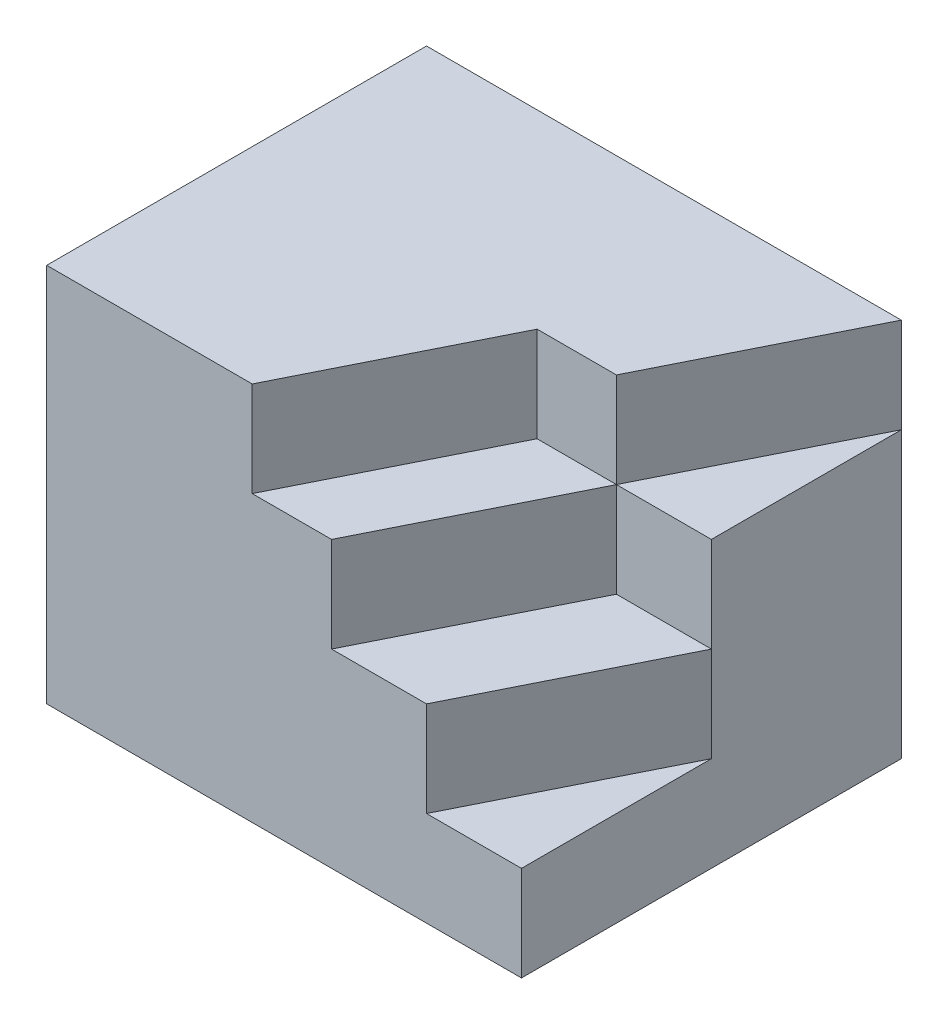
ISO-10303-21;
HEADER;
FILE_DESCRIPTION(('STEP AP214'),'2;1');
FILE_NAME('part.step','',(''),(''),'','','');
FILE_SCHEMA(('AUTOMOTIVE_DESIGN { 1 0 10303 214 1 1 1 1 }'));
ENDSEC;
DATA;
#1=APPLICATION_CONTEXT('core data for automotive mechanical design processes');
#2=APPLICATION_PROTOCOL_DEFINITION('international standard','automotive_design',2000,#1);
#3=PRODUCT_CONTEXT('',#1,'mechanical');
#4=PRODUCT('Part','Part','',(#3));
#5=PRODUCT_RELATED_PRODUCT_CATEGORY('part','',(#4));
#6=PRODUCT_DEFINITION_FORMATION('','',#4);
#7=PRODUCT_DEFINITION_CONTEXT('part definition',#1,'design');
#8=PRODUCT_DEFINITION('design','',#6,#7);
#9=PRODUCT_DEFINITION_SHAPE('','',#8);
#10=(LENGTH_UNIT() NAMED_UNIT(*) SI_UNIT(.MILLI.,.METRE.));
#11=(NAMED_UNIT(*) PLANE_ANGLE_UNIT() SI_UNIT($,.RADIAN.));
#12=(NAMED_UNIT(*) SI_UNIT($,.STERADIAN.) SOLID_ANGLE_UNIT());
#13=UNCERTAINTY_MEASURE_WITH_UNIT(LENGTH_MEASURE(1.E-05),#10,'distance_accuracy_value','');
#14=(GEOMETRIC_REPRESENTATION_CONTEXT(3) GLOBAL_UNCERTAINTY_ASSIGNED_CONTEXT((#13)) GLOBAL_UNIT_ASSIGNED_CONTEXT((#10,
#11,#12)) REPRESENTATION_CONTEXT('',''));
#15=CARTESIAN_POINT('',(0.,0.,0.));
#16=DIRECTION('',(0.,0.,1.));
#17=DIRECTION('',(1.,0.,0.));
#18=AXIS2_PLACEMENT_3D('',#15,#16,#17);
#19=CARTESIAN_POINT('',(15.,20.,0.));
#20=DIRECTION('',(-0.894427190999916,0.,-0.447213595499958));
#21=DIRECTION('',(-0.447213595499958,0.,0.894427190999916));
#22=AXIS2_PLACEMENT_3D('',#19,#20,#21);
#23=PLANE('',#22);
#24=DIRECTION('',(-0.447213595499958,0.,0.894427190999916));
#25=VECTOR('',#24,1.);
#26=CARTESIAN_POINT('',(15.,40.,0.));
#27=LINE('',#26,#25);
#28=CARTESIAN_POINT('',(25.,40.,-20.));
#29=VERTEX_POINT('',#28);
#30=CARTESIAN_POINT('',(15.,40.,0.));
#31=VERTEX_POINT('',#30);
#32=EDGE_CURVE('E154',#29,#31,#27,.T.);
#33=ORIENTED_EDGE('',*,*,#32,.T.);
#34=DIRECTION('',(0.,1.,0.));
#35=VECTOR('',#34,1.);
#36=CARTESIAN_POINT('',(15.,30.,0.));
#37=LINE('',#36,#35);
#38=CARTESIAN_POINT('',(15.,30.,0.));
#39=VERTEX_POINT('',#38);
#40=EDGE_CURVE('E133',#39,#31,#37,.T.);
#41=ORIENTED_EDGE('',*,*,#40,.F.);
#42=DIRECTION('',(-0.447213595499958,0.,0.894427190999916));
#43=VECTOR('',#42,1.);
#44=CARTESIAN_POINT('',(25.,30.,-20.));
#45=LINE('',#44,#43);
#46=CARTESIAN_POINT('',(25.,30.,-20.));
#47=VERTEX_POINT('',#46);
#48=EDGE_CURVE('E152',#47,#39,#45,.T.);
#49=ORIENTED_EDGE('',*,*,#48,.F.);
#50=DIRECTION('',(0.,-1.,0.));
#51=VECTOR('',#50,1.);
#52=CARTESIAN_POINT('',(25.,40.,-20.));
#53=LINE('',#52,#51);
#54=EDGE_CURVE('E11',#29,#47,#53,.T.);
#55=ORIENTED_EDGE('',*,*,#54,.F.);
#56=EDGE_LOOP('',(#33,#41,#49,#55));
#57=FACE_BOUND('',#56,.T.);
#58=ADVANCED_FACE('F39',(#57),#23,.F.);
#59=CARTESIAN_POINT('',(25.,10.,0.));
#60=DIRECTION('',(-0.894427190999916,0.,-0.447213595499958));
#61=DIRECTION('',(-0.447213595499958,0.,0.894427190999916));
#62=AXIS2_PLACEMENT_3D('',#59,#60,#61);
#63=PLANE('',#62);
#64=DIRECTION('',(0.447213595499958,0.,-0.894427190999916));
#65=VECTOR('',#64,1.);
#66=CARTESIAN_POINT('',(15.,20.,20.));
#67=LINE('',#66,#65);
#68=CARTESIAN_POINT('',(15.,20.,20.));
#69=VERTEX_POINT('',#68);
#70=CARTESIAN_POINT('',(25.,20.,0.));
#71=VERTEX_POINT('',#70);
#72=EDGE_CURVE('E269',#69,#71,#67,.T.);
#73=ORIENTED_EDGE('',*,*,#72,.F.);
#74=DIRECTION('',(0.,1.,0.));
#75=VECTOR('',#74,1.);
#76=CARTESIAN_POINT('',(15.,10.,20.));
#77=LINE('',#76,#75);
#78=CARTESIAN_POINT('',(15.,10.,20.));
#79=VERTEX_POINT('',#78);
#80=EDGE_CURVE('E199',#79,#69,#77,.T.);
#81=ORIENTED_EDGE('',*,*,#80,.F.);
#82=DIRECTION('',(-0.447213595499958,0.,0.894427190999916));
#83=VECTOR('',#82,1.);
#84=CARTESIAN_POINT('',(25.,10.,0.));
#85=LINE('',#84,#83);
#86=CARTESIAN_POINT('',(25.,10.,0.));
#87=VERTEX_POINT('',#86);
#88=EDGE_CURVE('E191',#87,#79,#85,.T.);
#89=ORIENTED_EDGE('',*,*,#88,.F.);
#90=DIRECTION('',(0.,1.,0.));
#91=VECTOR('',#90,1.);
#92=CARTESIAN_POINT('',(25.,10.,0.));
#93=LINE('',#92,#91);
#94=EDGE_CURVE('E198',#87,#71,#93,.T.);
#95=ORIENTED_EDGE('',*,*,#94,.T.);
#96=EDGE_LOOP('',(#73,#81,#89,#95));
#97=FACE_BOUND('',#96,.T.);
#98=ADVANCED_FACE('F296',(#97),#63,.F.);
#99=CARTESIAN_POINT('',(25.,40.,-20.));
#100=DIRECTION('',(-1.,0.,0.));
#101=DIRECTION('',(0.,0.,1.));
#102=AXIS2_PLACEMENT_3D('',#99,#100,#101);
#103=PLANE('',#102);
#104=CARTESIAN_POINT('',(25.,0.,-20.));
#105=VERTEX_POINT('',#104);
#106=EDGE_CURVE('E48',#47,#105,#53,.T.);
#107=ORIENTED_EDGE('',*,*,#106,.F.);
#108=DIRECTION('',(0.,0.,-1.));
#109=VECTOR('',#108,1.);
#110=CARTESIAN_POINT('',(25.,30.,0.));
#111=LINE('',#110,#109);
#112=CARTESIAN_POINT('',(25.,30.,0.));
#113=VERTEX_POINT('',#112);
#114=EDGE_CURVE('E162',#113,#47,#111,.T.);
#115=ORIENTED_EDGE('',*,*,#114,.F.);
#116=DIRECTION('',(0.,1.,0.));
#117=VECTOR('',#116,1.);
#118=CARTESIAN_POINT('',(25.,20.,0.));
#119=LINE('',#118,#117);
#120=EDGE_CURVE('E172',#71,#113,#119,.T.);
#121=ORIENTED_EDGE('',*,*,#120,.F.);
#122=ORIENTED_EDGE('',*,*,#94,.F.);
#123=DIRECTION('',(0.,0.,-1.));
#124=VECTOR('',#123,1.);
#125=CARTESIAN_POINT('',(25.,10.,0.));
#126=LINE('',#125,#124);
#127=CARTESIAN_POINT('',(25.,10.,20.));
#128=VERTEX_POINT('',#127);
#129=EDGE_CURVE('E183',#128,#87,#126,.T.);
#130=ORIENTED_EDGE('',*,*,#129,.F.);
#131=DIRECTION('',(0.,-1.,0.));
#132=VECTOR('',#131,1.);
#133=CARTESIAN_POINT('',(25.,40.,20.));
#134=LINE('',#133,#132);
#135=CARTESIAN_POINT('',(25.,0.,20.));
#136=VERTEX_POINT('',#135);
#137=EDGE_CURVE('E218',#128,#136,#134,.T.);
#138=ORIENTED_EDGE('',*,*,#137,.T.);
#139=DIRECTION('',(0.,0.,-1.));
#140=VECTOR('',#139,1.);
#141=CARTESIAN_POINT('',(25.,0.,-20.));
#142=LINE('',#141,#140);
#143=EDGE_CURVE('E203',#136,#105,#142,.T.);
#144=ORIENTED_EDGE('',*,*,#143,.T.);
#145=EDGE_LOOP('',(#107,#115,#121,#122,#130,#138,#144));
#146=FACE_BOUND('',#145,.T.);
#147=ADVANCED_FACE('F41',(#146),#103,.F.);
#148=CARTESIAN_POINT('',(-25.,40.,-20.));
#149=DIRECTION('',(0.,0.,1.));
#150=DIRECTION('',(1.,0.,0.));
#151=AXIS2_PLACEMENT_3D('',#148,#149,#150);
#152=PLANE('',#151);
#153=DIRECTION('',(-1.,0.,0.));
#154=VECTOR('',#153,1.);
#155=CARTESIAN_POINT('',(-25.,0.,-20.));
#156=LINE('',#155,#154);
#157=CARTESIAN_POINT('',(-25.,0.,-20.));
#158=VERTEX_POINT('',#157);
#159=EDGE_CURVE('E222',#105,#158,#156,.T.);
#160=ORIENTED_EDGE('',*,*,#159,.T.);
#161=DIRECTION('',(0.,-1.,0.));
#162=VECTOR('',#161,1.);
#163=CARTESIAN_POINT('',(-25.,40.,-20.));
#164=LINE('',#163,#162);
#165=CARTESIAN_POINT('',(-25.,40.,-20.));
#166=VERTEX_POINT('',#165);
#167=EDGE_CURVE('E236',#166,#158,#164,.T.);
#168=ORIENTED_EDGE('',*,*,#167,.F.);
#169=DIRECTION('',(-1.,0.,0.));
#170=VECTOR('',#169,1.);
#171=CARTESIAN_POINT('',(-25.,40.,-20.));
#172=LINE('',#171,#170);
#173=EDGE_CURVE('E207',#29,#166,#172,.T.);
#174=ORIENTED_EDGE('',*,*,#173,.F.);
#175=ORIENTED_EDGE('',*,*,#54,.T.);
#176=ORIENTED_EDGE('',*,*,#106,.T.);
#177=EDGE_LOOP('',(#160,#168,#174,#175,#176));
#178=FACE_BOUND('',#177,.T.);
#179=ADVANCED_FACE('F246',(#178),#152,.F.);
#180=CARTESIAN_POINT('',(-25.,40.,-20.));
#181=DIRECTION('',(1.,0.,0.));
#182=DIRECTION('',(0.,0.,-1.));
#183=AXIS2_PLACEMENT_3D('',#180,#181,#182);
#184=PLANE('',#183);
#185=DIRECTION('',(0.,0.,1.));
#186=VECTOR('',#185,1.);
#187=CARTESIAN_POINT('',(-25.,0.,-20.));
#188=LINE('',#187,#186);
#189=CARTESIAN_POINT('',(-25.,0.,20.));
#190=VERTEX_POINT('',#189);
#191=EDGE_CURVE('E225',#158,#190,#188,.T.);
#192=ORIENTED_EDGE('',*,*,#191,.T.);
#193=DIRECTION('',(0.,-1.,0.));
#194=VECTOR('',#193,1.);
#195=CARTESIAN_POINT('',(-25.,40.,20.));
#196=LINE('',#195,#194);
#197=CARTESIAN_POINT('',(-25.,40.,20.));
#198=VERTEX_POINT('',#197);
#199=EDGE_CURVE('E233',#198,#190,#196,.T.);
#200=ORIENTED_EDGE('',*,*,#199,.F.);
#201=DIRECTION('',(0.,0.,1.));
#202=VECTOR('',#201,1.);
#203=CARTESIAN_POINT('',(-25.,40.,-20.));
#204=LINE('',#203,#202);
#205=EDGE_CURVE('E210',#166,#198,#204,.T.);
#206=ORIENTED_EDGE('',*,*,#205,.F.);
#207=ORIENTED_EDGE('',*,*,#167,.T.);
#208=EDGE_LOOP('',(#192,#200,#206,#207));
#209=FACE_BOUND('',#208,.T.);
#210=ADVANCED_FACE('F262',(#209),#184,.F.);
#211=CARTESIAN_POINT('',(-25.,40.,20.));
#212=DIRECTION('',(0.,0.,-1.));
#213=DIRECTION('',(-1.,0.,0.));
#214=AXIS2_PLACEMENT_3D('',#211,#212,#213);
#215=PLANE('',#214);
#216=DIRECTION('',(1.,0.,0.));
#217=VECTOR('',#216,1.);
#218=CARTESIAN_POINT('',(4.99999999999999,30.,20.));
#219=LINE('',#218,#217);
#220=CARTESIAN_POINT('',(-3.35641807258816,30.,20.));
#221=VERTEX_POINT('',#220);
#222=CARTESIAN_POINT('',(4.99999999999999,30.,20.));
#223=VERTEX_POINT('',#222);
#224=EDGE_CURVE('E55',#221,#223,#219,.T.);
#225=ORIENTED_EDGE('',*,*,#224,.F.);
#226=DIRECTION('',(0.,1.,0.));
#227=VECTOR('',#226,1.);
#228=CARTESIAN_POINT('',(-3.35641807258816,30.,20.));
#229=LINE('',#228,#227);
#230=CARTESIAN_POINT('',(-3.35641807258816,40.,20.));
#231=VERTEX_POINT('',#230);
#232=EDGE_CURVE('E280',#221,#231,#229,.T.);
#233=ORIENTED_EDGE('',*,*,#232,.T.);
#234=DIRECTION('',(1.,0.,0.));
#235=VECTOR('',#234,1.);
#236=CARTESIAN_POINT('',(-25.,40.,20.));
#237=LINE('',#236,#235);
#238=EDGE_CURVE('E214',#198,#231,#237,.T.);
#239=ORIENTED_EDGE('',*,*,#238,.F.);
#240=ORIENTED_EDGE('',*,*,#199,.T.);
#241=DIRECTION('',(1.,0.,0.));
#242=VECTOR('',#241,1.);
#243=CARTESIAN_POINT('',(-25.,0.,20.));
#244=LINE('',#243,#242);
#245=EDGE_CURVE('E211',#190,#136,#244,.T.);
#246=ORIENTED_EDGE('',*,*,#245,.T.);
#247=ORIENTED_EDGE('',*,*,#137,.F.);
#248=DIRECTION('',(1.,0.,0.));
#249=VECTOR('',#248,1.);
#250=CARTESIAN_POINT('',(25.,10.,20.));
#251=LINE('',#250,#249);
#252=EDGE_CURVE('E195',#79,#128,#251,.T.);
#253=ORIENTED_EDGE('',*,*,#252,.F.);
#254=ORIENTED_EDGE('',*,*,#80,.T.);
#255=DIRECTION('',(1.,0.,0.));
#256=VECTOR('',#255,1.);
#257=CARTESIAN_POINT('',(4.99999999999999,20.,20.));
#258=LINE('',#257,#256);
#259=CARTESIAN_POINT('',(4.99999999999999,20.,20.));
#260=VERTEX_POINT('',#259);
#261=EDGE_CURVE('E63',#260,#69,#258,.T.);
#262=ORIENTED_EDGE('',*,*,#261,.F.);
#263=DIRECTION('',(0.,1.,0.));
#264=VECTOR('',#263,1.);
#265=CARTESIAN_POINT('',(4.99999999999999,20.,20.));
#266=LINE('',#265,#264);
#267=EDGE_CURVE('E179',#260,#223,#266,.T.);
#268=ORIENTED_EDGE('',*,*,#267,.T.);
#269=EDGE_LOOP('',(#225,#233,#239,#240,#246,#247,#253,#254,#262,#268));
#270=FACE_BOUND('',#269,.T.);
#271=ADVANCED_FACE('F258',(#270),#215,.F.);
#272=CARTESIAN_POINT('',(0.,40.,0.));
#273=DIRECTION('',(0.,1.,0.));
#274=DIRECTION('',(0.,0.,1.));
#275=AXIS2_PLACEMENT_3D('',#272,#273,#274);
#276=PLANE('',#275);
#277=DIRECTION('',(-0.447213595499958,0.,0.894427190999916));
#278=VECTOR('',#277,1.);
#279=CARTESIAN_POINT('',(6.64358192741185,40.,0.));
#280=LINE('',#279,#278);
#281=CARTESIAN_POINT('',(6.64358192741185,40.,0.));
#282=VERTEX_POINT('',#281);
#283=EDGE_CURVE('E146',#282,#231,#280,.T.);
#284=ORIENTED_EDGE('',*,*,#283,.F.);
#285=DIRECTION('',(-1.,0.,0.));
#286=VECTOR('',#285,1.);
#287=CARTESIAN_POINT('',(15.,40.,0.));
#288=LINE('',#287,#286);
#289=EDGE_CURVE('E266',#31,#282,#288,.T.);
#290=ORIENTED_EDGE('',*,*,#289,.F.);
#291=ORIENTED_EDGE('',*,*,#32,.F.);
#292=ORIENTED_EDGE('',*,*,#173,.T.);
#293=ORIENTED_EDGE('',*,*,#205,.T.);
#294=ORIENTED_EDGE('',*,*,#238,.T.);
#295=EDGE_LOOP('',(#284,#290,#291,#292,#293,#294));
#296=FACE_BOUND('',#295,.T.);
#297=ADVANCED_FACE('F265',(#296),#276,.T.);
#298=CARTESIAN_POINT('',(0.,0.,0.));
#299=DIRECTION('',(0.,1.,0.));
#300=DIRECTION('',(0.,0.,1.));
#301=AXIS2_PLACEMENT_3D('',#298,#299,#300);
#302=PLANE('',#301);
#303=ORIENTED_EDGE('',*,*,#143,.F.);
#304=ORIENTED_EDGE('',*,*,#245,.F.);
#305=ORIENTED_EDGE('',*,*,#191,.F.);
#306=ORIENTED_EDGE('',*,*,#159,.F.);
#307=EDGE_LOOP('',(#303,#304,#305,#306));
#308=FACE_BOUND('',#307,.T.);
#309=ADVANCED_FACE('F251',(#308),#302,.F.);
#310=CARTESIAN_POINT('',(0.,10.,0.));
#311=DIRECTION('',(0.,-1.,0.));
#312=DIRECTION('',(0.,0.,-1.));
#313=AXIS2_PLACEMENT_3D('',#310,#311,#312);
#314=PLANE('',#313);
#315=ORIENTED_EDGE('',*,*,#129,.T.);
#316=ORIENTED_EDGE('',*,*,#88,.T.);
#317=ORIENTED_EDGE('',*,*,#252,.T.);
#318=EDGE_LOOP('',(#315,#316,#317));
#319=FACE_BOUND('',#318,.T.);
#320=ADVANCED_FACE('F298',(#319),#314,.F.);
#321=DIRECTION('',(0.,1.,0.));
#322=VECTOR('',#321,1.);
#323=CARTESIAN_POINT('',(15.,20.,0.));
#324=LINE('',#323,#322);
#325=CARTESIAN_POINT('',(15.,20.,0.));
#326=VERTEX_POINT('',#325);
#327=EDGE_CURVE('E169',#326,#39,#324,.T.);
#328=ORIENTED_EDGE('',*,*,#327,.T.);
#329=DIRECTION('',(0.447213595499958,0.,-0.894427190999916));
#330=VECTOR('',#329,1.);
#331=CARTESIAN_POINT('',(15.,30.,0.));
#332=LINE('',#331,#330);
#333=EDGE_CURVE('E139',#223,#39,#332,.T.);
#334=ORIENTED_EDGE('',*,*,#333,.F.);
#335=ORIENTED_EDGE('',*,*,#267,.F.);
#336=DIRECTION('',(-0.447213595499958,0.,0.894427190999916));
#337=VECTOR('',#336,1.);
#338=CARTESIAN_POINT('',(15.,20.,0.));
#339=LINE('',#338,#337);
#340=EDGE_CURVE('E177',#326,#260,#339,.T.);
#341=ORIENTED_EDGE('',*,*,#340,.F.);
#342=EDGE_LOOP('',(#328,#334,#335,#341));
#343=FACE_BOUND('',#342,.T.);
#344=ADVANCED_FACE('F176',(#343),#23,.F.);
#345=CARTESIAN_POINT('',(25.,20.,0.));
#346=DIRECTION('',(0.,0.,-1.));
#347=DIRECTION('',(-1.,0.,0.));
#348=AXIS2_PLACEMENT_3D('',#345,#346,#347);
#349=PLANE('',#348);
#350=ORIENTED_EDGE('',*,*,#120,.T.);
#351=DIRECTION('',(1.,0.,0.));
#352=VECTOR('',#351,1.);
#353=CARTESIAN_POINT('',(15.,30.,0.));
#354=LINE('',#353,#352);
#355=EDGE_CURVE('E160',#39,#113,#354,.T.);
#356=ORIENTED_EDGE('',*,*,#355,.F.);
#357=ORIENTED_EDGE('',*,*,#327,.F.);
#358=DIRECTION('',(-1.,0.,0.));
#359=VECTOR('',#358,1.);
#360=CARTESIAN_POINT('',(25.,20.,0.));
#361=LINE('',#360,#359);
#362=EDGE_CURVE('E274',#71,#326,#361,.T.);
#363=ORIENTED_EDGE('',*,*,#362,.F.);
#364=EDGE_LOOP('',(#350,#356,#357,#363));
#365=FACE_BOUND('',#364,.T.);
#366=ADVANCED_FACE('F168',(#365),#349,.F.);
#367=CARTESIAN_POINT('',(0.,20.,0.));
#368=DIRECTION('',(0.,1.,0.));
#369=DIRECTION('',(0.,0.,1.));
#370=AXIS2_PLACEMENT_3D('',#367,#368,#369);
#371=PLANE('',#370);
#372=ORIENTED_EDGE('',*,*,#261,.T.);
#373=ORIENTED_EDGE('',*,*,#72,.T.);
#374=ORIENTED_EDGE('',*,*,#362,.T.);
#375=ORIENTED_EDGE('',*,*,#340,.T.);
#376=EDGE_LOOP('',(#372,#373,#374,#375));
#377=FACE_BOUND('',#376,.T.);
#378=ADVANCED_FACE('F294',(#377),#371,.T.);
#379=CARTESIAN_POINT('',(0.,30.,0.));
#380=DIRECTION('',(0.,-1.,0.));
#381=DIRECTION('',(0.,0.,-1.));
#382=AXIS2_PLACEMENT_3D('',#379,#380,#381);
#383=PLANE('',#382);
#384=ORIENTED_EDGE('',*,*,#114,.T.);
#385=ORIENTED_EDGE('',*,*,#48,.T.);
#386=ORIENTED_EDGE('',*,*,#355,.T.);
#387=EDGE_LOOP('',(#384,#385,#386));
#388=FACE_BOUND('',#387,.T.);
#389=ADVANCED_FACE('F159',(#388),#383,.F.);
#390=CARTESIAN_POINT('',(6.64358192741185,30.,0.));
#391=DIRECTION('',(-0.894427190999916,0.,-0.447213595499958));
#392=DIRECTION('',(-0.447213595499958,0.,0.894427190999916));
#393=AXIS2_PLACEMENT_3D('',#390,#391,#392);
#394=PLANE('',#393);
#395=ORIENTED_EDGE('',*,*,#283,.T.);
#396=ORIENTED_EDGE('',*,*,#232,.F.);
#397=DIRECTION('',(-0.447213595499958,0.,0.894427190999916));
#398=VECTOR('',#397,1.);
#399=CARTESIAN_POINT('',(6.64358192741185,30.,0.));
#400=LINE('',#399,#398);
#401=CARTESIAN_POINT('',(6.64358192741185,30.,0.));
#402=VERTEX_POINT('',#401);
#403=EDGE_CURVE('E138',#402,#221,#400,.T.);
#404=ORIENTED_EDGE('',*,*,#403,.F.);
#405=DIRECTION('',(0.,1.,0.));
#406=VECTOR('',#405,1.);
#407=CARTESIAN_POINT('',(6.64358192741185,30.,0.));
#408=LINE('',#407,#406);
#409=EDGE_CURVE('E135',#402,#282,#408,.T.);
#410=ORIENTED_EDGE('',*,*,#409,.T.);
#411=EDGE_LOOP('',(#395,#396,#404,#410));
#412=FACE_BOUND('',#411,.T.);
#413=ADVANCED_FACE('F322',(#412),#394,.F.);
#414=CARTESIAN_POINT('',(15.,30.,0.));
#415=DIRECTION('',(0.,0.,-1.));
#416=DIRECTION('',(-1.,0.,0.));
#417=AXIS2_PLACEMENT_3D('',#414,#415,#416);
#418=PLANE('',#417);
#419=ORIENTED_EDGE('',*,*,#289,.T.);
#420=ORIENTED_EDGE('',*,*,#409,.F.);
#421=DIRECTION('',(-1.,0.,0.));
#422=VECTOR('',#421,1.);
#423=CARTESIAN_POINT('',(15.,30.,0.));
#424=LINE('',#423,#422);
#425=EDGE_CURVE('E129',#39,#402,#424,.T.);
#426=ORIENTED_EDGE('',*,*,#425,.F.);
#427=ORIENTED_EDGE('',*,*,#40,.T.);
#428=EDGE_LOOP('',(#419,#420,#426,#427));
#429=FACE_BOUND('',#428,.T.);
#430=ADVANCED_FACE('F131',(#429),#418,.F.);
#431=CARTESIAN_POINT('',(0.,30.,0.));
#432=DIRECTION('',(0.,-1.,0.));
#433=DIRECTION('',(0.,0.,-1.));
#434=AXIS2_PLACEMENT_3D('',#431,#432,#433);
#435=PLANE('',#434);
#436=ORIENTED_EDGE('',*,*,#333,.T.);
#437=ORIENTED_EDGE('',*,*,#425,.T.);
#438=ORIENTED_EDGE('',*,*,#403,.T.);
#439=ORIENTED_EDGE('',*,*,#224,.T.);
#440=EDGE_LOOP('',(#436,#437,#438,#439));
#441=FACE_BOUND('',#440,.T.);
#442=ADVANCED_FACE('F141',(#441),#435,.F.);
#443=CLOSED_SHELL('',(#58,#98,#147,#179,#210,#271,#297,#309,#320,#344,#366,#378,#389,#413,#430,#442));
#444=MANIFOLD_SOLID_BREP('B2',#443);
#445=ADVANCED_BREP_SHAPE_REPRESENTATION('',(#18,#444),#14);
#446=SHAPE_DEFINITION_REPRESENTATION(#9,#445);
ENDSEC;
END-ISO-10303-21;
